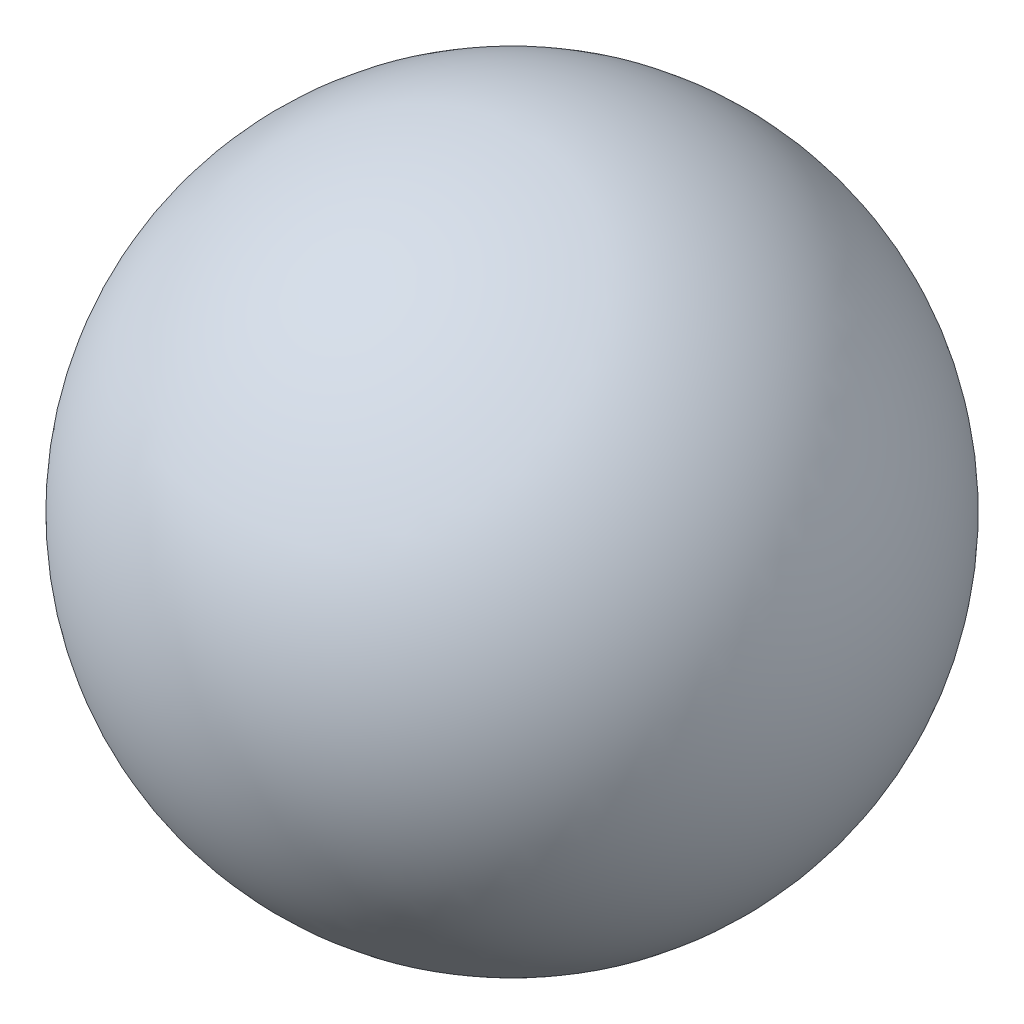
ISO-10303-21;
HEADER;
FILE_DESCRIPTION(('STEP AP214'),'2;1');
FILE_NAME('part.step','',(''),(''),'','','');
FILE_SCHEMA(('AUTOMOTIVE_DESIGN { 1 0 10303 214 1 1 1 1 }'));
ENDSEC;
DATA;
#1=APPLICATION_CONTEXT('core data for automotive mechanical design processes');
#2=APPLICATION_PROTOCOL_DEFINITION('international standard','automotive_design',2000,#1);
#3=PRODUCT_CONTEXT('',#1,'mechanical');
#4=PRODUCT('Part','Part','',(#3));
#5=PRODUCT_RELATED_PRODUCT_CATEGORY('part','',(#4));
#6=PRODUCT_DEFINITION_FORMATION('','',#4);
#7=PRODUCT_DEFINITION_CONTEXT('part definition',#1,'design');
#8=PRODUCT_DEFINITION('design','',#6,#7);
#9=PRODUCT_DEFINITION_SHAPE('','',#8);
#10=(LENGTH_UNIT() NAMED_UNIT(*) SI_UNIT(.MILLI.,.METRE.));
#11=(NAMED_UNIT(*) PLANE_ANGLE_UNIT() SI_UNIT($,.RADIAN.));
#12=(NAMED_UNIT(*) SI_UNIT($,.STERADIAN.) SOLID_ANGLE_UNIT());
#13=UNCERTAINTY_MEASURE_WITH_UNIT(LENGTH_MEASURE(1.E-05),#10,'distance_accuracy_value','');
#14=(GEOMETRIC_REPRESENTATION_CONTEXT(3) GLOBAL_UNCERTAINTY_ASSIGNED_CONTEXT((#13)) GLOBAL_UNIT_ASSIGNED_CONTEXT((#10,
#11,#12)) REPRESENTATION_CONTEXT('',''));
#15=CARTESIAN_POINT('',(0.,0.,0.));
#16=DIRECTION('',(0.,0.,1.));
#17=DIRECTION('',(1.,0.,0.));
#18=AXIS2_PLACEMENT_3D('',#15,#16,#17);
#19=CARTESIAN_POINT('',(0.,0.,0.));
#20=DIRECTION('',(0.,1.,0.));
#21=DIRECTION('',(1.,0.,0.));
#22=AXIS2_PLACEMENT_3D('',#19,#20,#21);
#23=SPHERICAL_SURFACE('',#22,254.);
#24=CARTESIAN_POINT('',(0.,254.,0.));
#25=VERTEX_POINT('',#24);
#26=VERTEX_LOOP('',#25);
#27=FACE_BOUND('',#26,.T.);
#28=ADVANCED_FACE('F33',(#27),#23,.T.);
#29=CLOSED_SHELL('',(#28));
#30=MANIFOLD_SOLID_BREP('B2',#29);
#31=ADVANCED_BREP_SHAPE_REPRESENTATION('',(#18,#30),#14);
#32=SHAPE_DEFINITION_REPRESENTATION(#9,#31);
ENDSEC;
END-ISO-10303-21;
